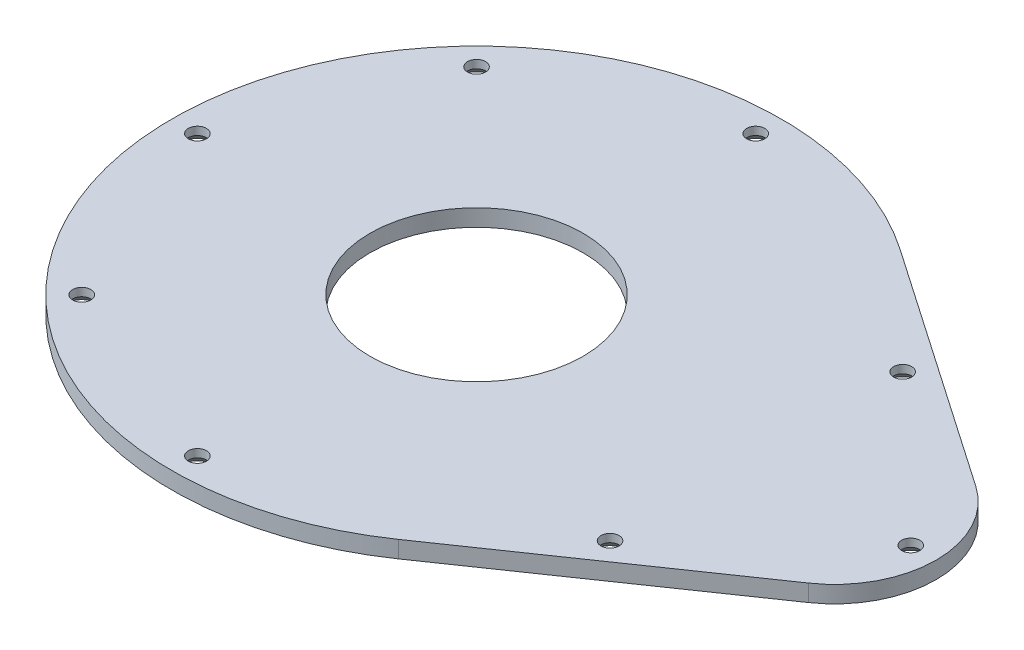
ISO-10303-21;
HEADER;
FILE_DESCRIPTION(('STEP AP214'),'2;1');
FILE_NAME('part.step','',(''),(''),'','','');
FILE_SCHEMA(('AUTOMOTIVE_DESIGN { 1 0 10303 214 1 1 1 1 }'));
ENDSEC;
DATA;
#1=APPLICATION_CONTEXT('core data for automotive mechanical design processes');
#2=APPLICATION_PROTOCOL_DEFINITION('international standard','automotive_design',2000,#1);
#3=PRODUCT_CONTEXT('',#1,'mechanical');
#4=PRODUCT('Part','Part','',(#3));
#5=PRODUCT_RELATED_PRODUCT_CATEGORY('part','',(#4));
#6=PRODUCT_DEFINITION_FORMATION('','',#4);
#7=PRODUCT_DEFINITION_CONTEXT('part definition',#1,'design');
#8=PRODUCT_DEFINITION('design','',#6,#7);
#9=PRODUCT_DEFINITION_SHAPE('','',#8);
#10=(LENGTH_UNIT() NAMED_UNIT(*) SI_UNIT(.MILLI.,.METRE.));
#11=(NAMED_UNIT(*) PLANE_ANGLE_UNIT() SI_UNIT($,.RADIAN.));
#12=(NAMED_UNIT(*) SI_UNIT($,.STERADIAN.) SOLID_ANGLE_UNIT());
#13=UNCERTAINTY_MEASURE_WITH_UNIT(LENGTH_MEASURE(1.E-05),#10,'distance_accuracy_value','');
#14=(GEOMETRIC_REPRESENTATION_CONTEXT(3) GLOBAL_UNCERTAINTY_ASSIGNED_CONTEXT((#13)) GLOBAL_UNIT_ASSIGNED_CONTEXT((#10,
#11,#12)) REPRESENTATION_CONTEXT('',''));
#15=CARTESIAN_POINT('',(0.,0.,0.));
#16=DIRECTION('',(0.,0.,1.));
#17=DIRECTION('',(1.,0.,0.));
#18=AXIS2_PLACEMENT_3D('',#15,#16,#17);
#19=CARTESIAN_POINT('',(0.,-3.175,0.));
#20=DIRECTION('',(0.,1.,0.));
#21=DIRECTION('',(0.,0.,1.));
#22=AXIS2_PLACEMENT_3D('',#19,#20,#21);
#23=CYLINDRICAL_SURFACE('',#22,57.15);
#24=DIRECTION('',(0.,-1.,0.));
#25=VECTOR('',#24,1.);
#26=CARTESIAN_POINT('',(32.4102079395085,108.442134940521,47.0712324176648));
#27=LINE('',#26,#25);
#28=CARTESIAN_POINT('',(32.4102079395085,0.,47.0712324176648));
#29=VERTEX_POINT('',#28);
#30=CARTESIAN_POINT('',(32.4102079395085,-3.175,47.0712324176648));
#31=VERTEX_POINT('',#30);
#32=EDGE_CURVE('E90',#29,#31,#27,.T.);
#33=ORIENTED_EDGE('',*,*,#32,.F.);
#34=CARTESIAN_POINT('',(0.,0.,0.));
#35=DIRECTION('',(0.,1.,0.));
#36=DIRECTION('',(0.,0.,1.));
#37=AXIS2_PLACEMENT_3D('',#34,#35,#36);
#38=CIRCLE('',#37,57.15);
#39=CARTESIAN_POINT('',(32.4102079395086,0.,-47.0712324176648));
#40=VERTEX_POINT('',#39);
#41=EDGE_CURVE('E35',#40,#29,#38,.T.);
#42=ORIENTED_EDGE('',*,*,#41,.F.);
#43=DIRECTION('',(0.,-1.,0.));
#44=VECTOR('',#43,1.);
#45=CARTESIAN_POINT('',(32.4102079395085,108.442134940521,-47.0712324176648));
#46=LINE('',#45,#44);
#47=CARTESIAN_POINT('',(32.4102079395085,-3.175,-47.0712324176648));
#48=VERTEX_POINT('',#47);
#49=EDGE_CURVE('E46',#40,#48,#46,.T.);
#50=ORIENTED_EDGE('',*,*,#49,.T.);
#51=CARTESIAN_POINT('',(0.,-3.175,0.));
#52=DIRECTION('',(0.,1.,0.));
#53=DIRECTION('',(0.,0.,1.));
#54=AXIS2_PLACEMENT_3D('',#51,#52,#53);
#55=CIRCLE('',#54,57.15);
#56=EDGE_CURVE('E11',#48,#31,#55,.T.);
#57=ORIENTED_EDGE('',*,*,#56,.T.);
#58=EDGE_LOOP('',(#33,#42,#50,#57));
#59=FACE_BOUND('',#58,.T.);
#60=ADVANCED_FACE('F32',(#59),#23,.T.);
#61=CARTESIAN_POINT('',(0.,-3.175,0.));
#62=DIRECTION('',(0.,1.,0.));
#63=DIRECTION('',(0.,0.,1.));
#64=AXIS2_PLACEMENT_3D('',#61,#62,#63);
#65=PLANE('',#64);
#66=CARTESIAN_POINT('',(0.,-3.175,52.3748));
#67=DIRECTION('',(0.,-1.,0.));
#68=DIRECTION('',(0.,0.,-1.));
#69=AXIS2_PLACEMENT_3D('',#66,#67,#68);
#70=CIRCLE('',#69,3.36);
#71=CARTESIAN_POINT('',(0.,-3.175,49.0148));
#72=VERTEX_POINT('',#71);
#73=EDGE_CURVE('E336',#72,#72,#70,.T.);
#74=ORIENTED_EDGE('',*,*,#73,.F.);
#75=EDGE_LOOP('',(#74));
#76=FACE_BOUND('',#75,.T.);
#77=CARTESIAN_POINT('',(-52.3748,-3.175,0.));
#78=DIRECTION('',(0.,-1.,0.));
#79=DIRECTION('',(0.,0.,-1.));
#80=AXIS2_PLACEMENT_3D('',#77,#78,#79);
#81=CIRCLE('',#80,3.36);
#82=CARTESIAN_POINT('',(-52.3748,-3.175,-3.35999999999999));
#83=VERTEX_POINT('',#82);
#84=EDGE_CURVE('E343',#83,#83,#81,.T.);
#85=ORIENTED_EDGE('',*,*,#84,.F.);
#86=EDGE_LOOP('',(#85));
#87=FACE_BOUND('',#86,.T.);
#88=CARTESIAN_POINT('',(-37.0345762432893,-3.175,-37.0345762432891));
#89=DIRECTION('',(0.,-1.,0.));
#90=DIRECTION('',(0.,0.,-1.));
#91=AXIS2_PLACEMENT_3D('',#88,#89,#90);
#92=CIRCLE('',#91,3.36);
#93=CARTESIAN_POINT('',(-37.0345762432893,-3.175,-40.3945762432891));
#94=VERTEX_POINT('',#93);
#95=EDGE_CURVE('E352',#94,#94,#92,.T.);
#96=ORIENTED_EDGE('',*,*,#95,.F.);
#97=EDGE_LOOP('',(#96));
#98=FACE_BOUND('',#97,.T.);
#99=CARTESIAN_POINT('',(0.,-3.175,-52.3748));
#100=DIRECTION('',(0.,-1.,0.));
#101=DIRECTION('',(0.,0.,-1.));
#102=AXIS2_PLACEMENT_3D('',#99,#100,#101);
#103=CIRCLE('',#102,3.36);
#104=CARTESIAN_POINT('',(0.,-3.175,-55.7348));
#105=VERTEX_POINT('',#104);
#106=EDGE_CURVE('E361',#105,#105,#103,.T.);
#107=ORIENTED_EDGE('',*,*,#106,.F.);
#108=EDGE_LOOP('',(#107));
#109=FACE_BOUND('',#108,.T.);
#110=CARTESIAN_POINT('',(52.490252362949,-3.175,-27.4477586364339));
#111=DIRECTION('',(0.,-1.,0.));
#112=DIRECTION('',(0.,0.,-1.));
#113=AXIS2_PLACEMENT_3D('',#110,#111,#112);
#114=CIRCLE('',#113,3.36);
#115=CARTESIAN_POINT('',(52.490252362949,-3.175,-30.8077586364339));
#116=VERTEX_POINT('',#115);
#117=EDGE_CURVE('E370',#116,#116,#114,.T.);
#118=ORIENTED_EDGE('',*,*,#117,.F.);
#119=EDGE_LOOP('',(#118));
#120=FACE_BOUND('',#119,.T.);
#121=CARTESIAN_POINT('',(81.4578,-3.175,0.));
#122=DIRECTION('',(0.,-1.,0.));
#123=DIRECTION('',(0.,0.,-1.));
#124=AXIS2_PLACEMENT_3D('',#121,#122,#123);
#125=CIRCLE('',#124,3.36);
#126=CARTESIAN_POINT('',(81.4578,-3.175,-3.36000000000001));
#127=VERTEX_POINT('',#126);
#128=EDGE_CURVE('E379',#127,#127,#125,.T.);
#129=ORIENTED_EDGE('',*,*,#128,.F.);
#130=EDGE_LOOP('',(#129));
#131=FACE_BOUND('',#130,.T.);
#132=CARTESIAN_POINT('',(52.490252362949,-3.175,27.4477586364339));
#133=DIRECTION('',(0.,-1.,0.));
#134=DIRECTION('',(0.,0.,-1.));
#135=AXIS2_PLACEMENT_3D('',#132,#133,#134);
#136=CIRCLE('',#135,3.36);
#137=CARTESIAN_POINT('',(52.490252362949,-3.175,24.0877586364339));
#138=VERTEX_POINT('',#137);
#139=EDGE_CURVE('E388',#138,#138,#136,.T.);
#140=ORIENTED_EDGE('',*,*,#139,.F.);
#141=EDGE_LOOP('',(#140));
#142=FACE_BOUND('',#141,.T.);
#143=CARTESIAN_POINT('',(-37.0345762432893,-3.175,37.0345762432891));
#144=DIRECTION('',(0.,-1.,0.));
#145=DIRECTION('',(0.,0.,-1.));
#146=AXIS2_PLACEMENT_3D('',#143,#144,#145);
#147=CIRCLE('',#146,3.36);
#148=CARTESIAN_POINT('',(-37.0345762432893,-3.175,33.6745762432891));
#149=VERTEX_POINT('',#148);
#150=EDGE_CURVE('E397',#149,#149,#147,.T.);
#151=ORIENTED_EDGE('',*,*,#150,.F.);
#152=EDGE_LOOP('',(#151));
#153=FACE_BOUND('',#152,.T.);
#154=CARTESIAN_POINT('',(0.,-3.175,0.));
#155=DIRECTION('',(0.,1.,0.));
#156=DIRECTION('',(0.,0.,1.));
#157=AXIS2_PLACEMENT_3D('',#154,#155,#156);
#158=CIRCLE('',#157,20.);
#159=CARTESIAN_POINT('',(0.,-3.175,20.));
#160=VERTEX_POINT('',#159);
#161=EDGE_CURVE('E108',#160,#160,#158,.T.);
#162=ORIENTED_EDGE('',*,*,#161,.T.);
#163=EDGE_LOOP('',(#162));
#164=FACE_BOUND('',#163,.T.);
#165=ORIENTED_EDGE('',*,*,#56,.F.);
#166=DIRECTION('',(0.823643611857652,0.,0.56710775047259));
#167=VECTOR('',#166,1.);
#168=CARTESIAN_POINT('',(32.4102079395085,-3.175,-47.0712324176648));
#169=LINE('',#168,#167);
#170=CARTESIAN_POINT('',(77.9864026465028,-3.175,-15.6904108058883));
#171=VERTEX_POINT('',#170);
#172=EDGE_CURVE('E78',#48,#171,#169,.T.);
#173=ORIENTED_EDGE('',*,*,#172,.T.);
#174=CARTESIAN_POINT('',(67.183,-3.175,0.));
#175=DIRECTION('',(0.,-1.,0.));
#176=DIRECTION('',(0.,0.,-1.));
#177=AXIS2_PLACEMENT_3D('',#174,#175,#176);
#178=CIRCLE('',#177,19.05);
#179=CARTESIAN_POINT('',(77.9864026465028,-3.175,15.6904108058883));
#180=VERTEX_POINT('',#179);
#181=EDGE_CURVE('E94',#171,#180,#178,.T.);
#182=ORIENTED_EDGE('',*,*,#181,.T.);
#183=DIRECTION('',(-0.823643611857652,0.,0.56710775047259));
#184=VECTOR('',#183,1.);
#185=CARTESIAN_POINT('',(32.4102079395085,-3.175,47.0712324176648));
#186=LINE('',#185,#184);
#187=EDGE_CURVE('E85',#180,#31,#186,.T.);
#188=ORIENTED_EDGE('',*,*,#187,.T.);
#189=EDGE_LOOP('',(#165,#173,#182,#188));
#190=FACE_BOUND('',#189,.T.);
#191=ADVANCED_FACE('F93',(#76,#87,#98,#109,#120,#131,#142,#153,#164,#190),#65,.F.);
#192=CARTESIAN_POINT('',(0.,0.,0.));
#193=DIRECTION('',(0.,1.,0.));
#194=DIRECTION('',(0.,0.,1.));
#195=AXIS2_PLACEMENT_3D('',#192,#193,#194);
#196=PLANE('',#195);
#197=CARTESIAN_POINT('',(0.,0.,52.3748));
#198=DIRECTION('',(0.,-1.,0.));
#199=DIRECTION('',(0.,0.,-1.));
#200=AXIS2_PLACEMENT_3D('',#197,#198,#199);
#201=CIRCLE('',#200,1.7);
#202=CARTESIAN_POINT('',(0.,0.,50.6748));
#203=VERTEX_POINT('',#202);
#204=EDGE_CURVE('E338',#203,#203,#201,.T.);
#205=ORIENTED_EDGE('',*,*,#204,.T.);
#206=EDGE_LOOP('',(#205));
#207=FACE_BOUND('',#206,.T.);
#208=CARTESIAN_POINT('',(-52.3748,0.,0.));
#209=DIRECTION('',(0.,-1.,0.));
#210=DIRECTION('',(0.,0.,-1.));
#211=AXIS2_PLACEMENT_3D('',#208,#209,#210);
#212=CIRCLE('',#211,1.7);
#213=CARTESIAN_POINT('',(-52.3748,0.,-1.69999999999998));
#214=VERTEX_POINT('',#213);
#215=EDGE_CURVE('E349',#214,#214,#212,.T.);
#216=ORIENTED_EDGE('',*,*,#215,.T.);
#217=EDGE_LOOP('',(#216));
#218=FACE_BOUND('',#217,.T.);
#219=CARTESIAN_POINT('',(-37.0345762432893,0.,-37.0345762432891));
#220=DIRECTION('',(0.,-1.,0.));
#221=DIRECTION('',(0.,0.,-1.));
#222=AXIS2_PLACEMENT_3D('',#219,#220,#221);
#223=CIRCLE('',#222,1.7);
#224=CARTESIAN_POINT('',(-37.0345762432893,0.,-38.7345762432891));
#225=VERTEX_POINT('',#224);
#226=EDGE_CURVE('E358',#225,#225,#223,.T.);
#227=ORIENTED_EDGE('',*,*,#226,.T.);
#228=EDGE_LOOP('',(#227));
#229=FACE_BOUND('',#228,.T.);
#230=CARTESIAN_POINT('',(0.,0.,-52.3748));
#231=DIRECTION('',(0.,-1.,0.));
#232=DIRECTION('',(0.,0.,-1.));
#233=AXIS2_PLACEMENT_3D('',#230,#231,#232);
#234=CIRCLE('',#233,1.7);
#235=CARTESIAN_POINT('',(0.,0.,-54.0748));
#236=VERTEX_POINT('',#235);
#237=EDGE_CURVE('E367',#236,#236,#234,.T.);
#238=ORIENTED_EDGE('',*,*,#237,.T.);
#239=EDGE_LOOP('',(#238));
#240=FACE_BOUND('',#239,.T.);
#241=CARTESIAN_POINT('',(52.490252362949,0.,-27.4477586364339));
#242=DIRECTION('',(0.,-1.,0.));
#243=DIRECTION('',(0.,0.,-1.));
#244=AXIS2_PLACEMENT_3D('',#241,#242,#243);
#245=CIRCLE('',#244,1.7);
#246=CARTESIAN_POINT('',(52.490252362949,0.,-29.1477586364339));
#247=VERTEX_POINT('',#246);
#248=EDGE_CURVE('E376',#247,#247,#245,.T.);
#249=ORIENTED_EDGE('',*,*,#248,.T.);
#250=EDGE_LOOP('',(#249));
#251=FACE_BOUND('',#250,.T.);
#252=CARTESIAN_POINT('',(81.4578,0.,0.));
#253=DIRECTION('',(0.,-1.,0.));
#254=DIRECTION('',(0.,0.,-1.));
#255=AXIS2_PLACEMENT_3D('',#252,#253,#254);
#256=CIRCLE('',#255,1.69999999999999);
#257=CARTESIAN_POINT('',(81.4578,0.,-1.7));
#258=VERTEX_POINT('',#257);
#259=EDGE_CURVE('E385',#258,#258,#256,.T.);
#260=ORIENTED_EDGE('',*,*,#259,.T.);
#261=EDGE_LOOP('',(#260));
#262=FACE_BOUND('',#261,.T.);
#263=CARTESIAN_POINT('',(52.490252362949,0.,27.4477586364339));
#264=DIRECTION('',(0.,-1.,0.));
#265=DIRECTION('',(0.,0.,-1.));
#266=AXIS2_PLACEMENT_3D('',#263,#264,#265);
#267=CIRCLE('',#266,1.7);
#268=CARTESIAN_POINT('',(52.490252362949,0.,25.7477586364339));
#269=VERTEX_POINT('',#268);
#270=EDGE_CURVE('E394',#269,#269,#267,.T.);
#271=ORIENTED_EDGE('',*,*,#270,.T.);
#272=EDGE_LOOP('',(#271));
#273=FACE_BOUND('',#272,.T.);
#274=CARTESIAN_POINT('',(-37.0345762432893,0.,37.0345762432891));
#275=DIRECTION('',(0.,-1.,0.));
#276=DIRECTION('',(0.,0.,-1.));
#277=AXIS2_PLACEMENT_3D('',#274,#275,#276);
#278=CIRCLE('',#277,1.7);
#279=CARTESIAN_POINT('',(-37.0345762432893,0.,35.3345762432891));
#280=VERTEX_POINT('',#279);
#281=EDGE_CURVE('E96',#280,#280,#278,.T.);
#282=ORIENTED_EDGE('',*,*,#281,.T.);
#283=EDGE_LOOP('',(#282));
#284=FACE_BOUND('',#283,.T.);
#285=CARTESIAN_POINT('',(0.,0.,0.));
#286=DIRECTION('',(0.,1.,0.));
#287=DIRECTION('',(0.,0.,1.));
#288=AXIS2_PLACEMENT_3D('',#285,#286,#287);
#289=CIRCLE('',#288,20.);
#290=CARTESIAN_POINT('',(0.,0.,20.));
#291=VERTEX_POINT('',#290);
#292=EDGE_CURVE('E107',#291,#291,#289,.T.);
#293=ORIENTED_EDGE('',*,*,#292,.F.);
#294=EDGE_LOOP('',(#293));
#295=FACE_BOUND('',#294,.T.);
#296=ORIENTED_EDGE('',*,*,#41,.T.);
#297=DIRECTION('',(-0.823643611857652,0.,0.56710775047259));
#298=VECTOR('',#297,1.);
#299=CARTESIAN_POINT('',(32.4102079395085,0.,47.0712324176648));
#300=LINE('',#299,#298);
#301=CARTESIAN_POINT('',(77.9864026465028,0.,15.6904108058883));
#302=VERTEX_POINT('',#301);
#303=EDGE_CURVE('E72',#302,#29,#300,.T.);
#304=ORIENTED_EDGE('',*,*,#303,.F.);
#305=CARTESIAN_POINT('',(67.183,0.,0.));
#306=DIRECTION('',(0.,1.,0.));
#307=DIRECTION('',(0.,0.,1.));
#308=AXIS2_PLACEMENT_3D('',#305,#306,#307);
#309=CIRCLE('',#308,19.05);
#310=CARTESIAN_POINT('',(77.9864026465028,0.,-15.6904108058883));
#311=VERTEX_POINT('',#310);
#312=EDGE_CURVE('E101',#311,#302,#309,.F.);
#313=ORIENTED_EDGE('',*,*,#312,.F.);
#314=DIRECTION('',(0.823643611857652,0.,0.56710775047259));
#315=VECTOR('',#314,1.);
#316=CARTESIAN_POINT('',(32.4102079395085,0.,-47.0712324176648));
#317=LINE('',#316,#315);
#318=EDGE_CURVE('E89',#40,#311,#317,.T.);
#319=ORIENTED_EDGE('',*,*,#318,.F.);
#320=EDGE_LOOP('',(#296,#304,#313,#319));
#321=FACE_BOUND('',#320,.T.);
#322=ADVANCED_FACE('F116',(#207,#218,#229,#240,#251,#262,#273,#284,#295,#321),#196,.T.);
#323=CARTESIAN_POINT('',(0.,-3.175,0.));
#324=DIRECTION('',(0.,1.,0.));
#325=DIRECTION('',(0.,0.,1.));
#326=AXIS2_PLACEMENT_3D('',#323,#324,#325);
#327=CYLINDRICAL_SURFACE('',#326,20.);
#328=ORIENTED_EDGE('',*,*,#161,.F.);
#329=EDGE_LOOP('',(#328));
#330=FACE_BOUND('',#329,.T.);
#331=ORIENTED_EDGE('',*,*,#292,.T.);
#332=EDGE_LOOP('',(#331));
#333=FACE_BOUND('',#332,.T.);
#334=ADVANCED_FACE('F114',(#330,#333),#327,.F.);
#335=CARTESIAN_POINT('',(32.4102079395085,108.442134940521,47.0712324176648));
#336=DIRECTION('',(0.56710775047259,0.,0.823643611857652));
#337=DIRECTION('',(0.823643611857652,0.,-0.56710775047259));
#338=AXIS2_PLACEMENT_3D('',#335,#336,#337);
#339=PLANE('',#338);
#340=DIRECTION('',(0.,-1.,0.));
#341=VECTOR('',#340,1.);
#342=CARTESIAN_POINT('',(77.9864026465028,108.442134940521,15.6904108058883));
#343=LINE('',#342,#341);
#344=EDGE_CURVE('E55',#302,#180,#343,.T.);
#345=ORIENTED_EDGE('',*,*,#344,.F.);
#346=ORIENTED_EDGE('',*,*,#303,.T.);
#347=ORIENTED_EDGE('',*,*,#32,.T.);
#348=ORIENTED_EDGE('',*,*,#187,.F.);
#349=EDGE_LOOP('',(#345,#346,#347,#348));
#350=FACE_BOUND('',#349,.T.);
#351=ADVANCED_FACE('F130',(#350),#339,.T.);
#352=CARTESIAN_POINT('',(32.4102079395085,108.442134940521,-47.0712324176648));
#353=DIRECTION('',(0.56710775047259,0.,-0.823643611857652));
#354=DIRECTION('',(-0.823643611857652,0.,-0.56710775047259));
#355=AXIS2_PLACEMENT_3D('',#352,#353,#354);
#356=PLANE('',#355);
#357=ORIENTED_EDGE('',*,*,#49,.F.);
#358=ORIENTED_EDGE('',*,*,#318,.T.);
#359=DIRECTION('',(0.,-1.,0.));
#360=VECTOR('',#359,1.);
#361=CARTESIAN_POINT('',(77.9864026465028,108.442134940521,-15.6904108058883));
#362=LINE('',#361,#360);
#363=EDGE_CURVE('E81',#311,#171,#362,.T.);
#364=ORIENTED_EDGE('',*,*,#363,.T.);
#365=ORIENTED_EDGE('',*,*,#172,.F.);
#366=EDGE_LOOP('',(#357,#358,#364,#365));
#367=FACE_BOUND('',#366,.T.);
#368=ADVANCED_FACE('F79',(#367),#356,.T.);
#369=CARTESIAN_POINT('',(67.183,108.442134940521,0.));
#370=DIRECTION('',(0.,-1.,0.));
#371=DIRECTION('',(0.,0.,-1.));
#372=AXIS2_PLACEMENT_3D('',#369,#370,#371);
#373=CYLINDRICAL_SURFACE('',#372,19.05);
#374=ORIENTED_EDGE('',*,*,#363,.F.);
#375=ORIENTED_EDGE('',*,*,#312,.T.);
#376=ORIENTED_EDGE('',*,*,#344,.T.);
#377=ORIENTED_EDGE('',*,*,#181,.F.);
#378=EDGE_LOOP('',(#374,#375,#376,#377));
#379=FACE_BOUND('',#378,.T.);
#380=ADVANCED_FACE('F119',(#379),#373,.T.);
#381=CARTESIAN_POINT('',(-37.0345762432893,-3.175,37.0345762432891));
#382=DIRECTION('',(0.,-1.,0.));
#383=DIRECTION('',(0.,0.,-1.));
#384=AXIS2_PLACEMENT_3D('',#381,#382,#383);
#385=CYLINDRICAL_SURFACE('',#384,1.7);
#386=ORIENTED_EDGE('',*,*,#281,.F.);
#387=EDGE_LOOP('',(#386));
#388=FACE_BOUND('',#387,.T.);
#389=CARTESIAN_POINT('',(-37.0345762432893,-1.515,37.0345762432891));
#390=DIRECTION('',(0.,-1.,0.));
#391=DIRECTION('',(0.,0.,-1.));
#392=AXIS2_PLACEMENT_3D('',#389,#390,#391);
#393=CIRCLE('',#392,1.7);
#394=CARTESIAN_POINT('',(-37.0345762432893,-1.515,35.3345762432891));
#395=VERTEX_POINT('',#394);
#396=EDGE_CURVE('E400',#395,#395,#393,.T.);
#397=ORIENTED_EDGE('',*,*,#396,.T.);
#398=EDGE_LOOP('',(#397));
#399=FACE_BOUND('',#398,.T.);
#400=ADVANCED_FACE('F121',(#388,#399),#385,.F.);
#401=CARTESIAN_POINT('',(-37.0345762432893,-3.175,37.0345762432891));
#402=DIRECTION('',(0.,-1.,0.));
#403=DIRECTION('',(0.,0.,-1.));
#404=AXIS2_PLACEMENT_3D('',#401,#402,#403);
#405=CONICAL_SURFACE('',#404,3.36,0.785398163397449);
#406=ORIENTED_EDGE('',*,*,#396,.F.);
#407=EDGE_LOOP('',(#406));
#408=FACE_BOUND('',#407,.T.);
#409=ORIENTED_EDGE('',*,*,#150,.T.);
#410=EDGE_LOOP('',(#409));
#411=FACE_BOUND('',#410,.T.);
#412=ADVANCED_FACE('F127',(#408,#411),#405,.F.);
#413=CARTESIAN_POINT('',(52.490252362949,-3.175,27.4477586364339));
#414=DIRECTION('',(0.,-1.,0.));
#415=DIRECTION('',(0.,0.,-1.));
#416=AXIS2_PLACEMENT_3D('',#413,#414,#415);
#417=CYLINDRICAL_SURFACE('',#416,1.7);
#418=ORIENTED_EDGE('',*,*,#270,.F.);
#419=EDGE_LOOP('',(#418));
#420=FACE_BOUND('',#419,.T.);
#421=CARTESIAN_POINT('',(52.490252362949,-1.515,27.4477586364339));
#422=DIRECTION('',(0.,-1.,0.));
#423=DIRECTION('',(0.,0.,-1.));
#424=AXIS2_PLACEMENT_3D('',#421,#422,#423);
#425=CIRCLE('',#424,1.7);
#426=CARTESIAN_POINT('',(52.490252362949,-1.515,25.7477586364339));
#427=VERTEX_POINT('',#426);
#428=EDGE_CURVE('E391',#427,#427,#425,.T.);
#429=ORIENTED_EDGE('',*,*,#428,.T.);
#430=EDGE_LOOP('',(#429));
#431=FACE_BOUND('',#430,.T.);
#432=ADVANCED_FACE('F187',(#420,#431),#417,.F.);
#433=CARTESIAN_POINT('',(52.490252362949,-3.175,27.4477586364339));
#434=DIRECTION('',(0.,-1.,0.));
#435=DIRECTION('',(0.,0.,-1.));
#436=AXIS2_PLACEMENT_3D('',#433,#434,#435);
#437=CONICAL_SURFACE('',#436,3.36,0.785398163397449);
#438=ORIENTED_EDGE('',*,*,#428,.F.);
#439=EDGE_LOOP('',(#438));
#440=FACE_BOUND('',#439,.T.);
#441=ORIENTED_EDGE('',*,*,#139,.T.);
#442=EDGE_LOOP('',(#441));
#443=FACE_BOUND('',#442,.T.);
#444=ADVANCED_FACE('F197',(#440,#443),#437,.F.);
#445=CARTESIAN_POINT('',(81.4578,-3.175,0.));
#446=DIRECTION('',(0.,-1.,0.));
#447=DIRECTION('',(0.,0.,-1.));
#448=AXIS2_PLACEMENT_3D('',#445,#446,#447);
#449=CYLINDRICAL_SURFACE('',#448,1.69999999999999);
#450=ORIENTED_EDGE('',*,*,#259,.F.);
#451=EDGE_LOOP('',(#450));
#452=FACE_BOUND('',#451,.T.);
#453=CARTESIAN_POINT('',(81.4578,-1.515,0.));
#454=DIRECTION('',(0.,-1.,0.));
#455=DIRECTION('',(0.,0.,-1.));
#456=AXIS2_PLACEMENT_3D('',#453,#454,#455);
#457=CIRCLE('',#456,1.69999999999999);
#458=CARTESIAN_POINT('',(81.4578,-1.515,-1.7));
#459=VERTEX_POINT('',#458);
#460=EDGE_CURVE('E382',#459,#459,#457,.T.);
#461=ORIENTED_EDGE('',*,*,#460,.T.);
#462=EDGE_LOOP('',(#461));
#463=FACE_BOUND('',#462,.T.);
#464=ADVANCED_FACE('F207',(#452,#463),#449,.F.);
#465=CARTESIAN_POINT('',(81.4578,-3.175,0.));
#466=DIRECTION('',(0.,-1.,0.));
#467=DIRECTION('',(0.,0.,-1.));
#468=AXIS2_PLACEMENT_3D('',#465,#466,#467);
#469=CONICAL_SURFACE('',#468,3.36,0.785398163397451);
#470=ORIENTED_EDGE('',*,*,#460,.F.);
#471=EDGE_LOOP('',(#470));
#472=FACE_BOUND('',#471,.T.);
#473=ORIENTED_EDGE('',*,*,#128,.T.);
#474=EDGE_LOOP('',(#473));
#475=FACE_BOUND('',#474,.T.);
#476=ADVANCED_FACE('F217',(#472,#475),#469,.F.);
#477=CARTESIAN_POINT('',(52.490252362949,-3.175,-27.4477586364339));
#478=DIRECTION('',(0.,-1.,0.));
#479=DIRECTION('',(0.,0.,-1.));
#480=AXIS2_PLACEMENT_3D('',#477,#478,#479);
#481=CYLINDRICAL_SURFACE('',#480,1.7);
#482=ORIENTED_EDGE('',*,*,#248,.F.);
#483=EDGE_LOOP('',(#482));
#484=FACE_BOUND('',#483,.T.);
#485=CARTESIAN_POINT('',(52.490252362949,-1.515,-27.4477586364339));
#486=DIRECTION('',(0.,-1.,0.));
#487=DIRECTION('',(0.,0.,-1.));
#488=AXIS2_PLACEMENT_3D('',#485,#486,#487);
#489=CIRCLE('',#488,1.7);
#490=CARTESIAN_POINT('',(52.490252362949,-1.515,-29.1477586364339));
#491=VERTEX_POINT('',#490);
#492=EDGE_CURVE('E373',#491,#491,#489,.T.);
#493=ORIENTED_EDGE('',*,*,#492,.T.);
#494=EDGE_LOOP('',(#493));
#495=FACE_BOUND('',#494,.T.);
#496=ADVANCED_FACE('F227',(#484,#495),#481,.F.);
#497=CARTESIAN_POINT('',(52.490252362949,-3.175,-27.4477586364339));
#498=DIRECTION('',(0.,-1.,0.));
#499=DIRECTION('',(0.,0.,-1.));
#500=AXIS2_PLACEMENT_3D('',#497,#498,#499);
#501=CONICAL_SURFACE('',#500,3.36,0.785398163397449);
#502=ORIENTED_EDGE('',*,*,#492,.F.);
#503=EDGE_LOOP('',(#502));
#504=FACE_BOUND('',#503,.T.);
#505=ORIENTED_EDGE('',*,*,#117,.T.);
#506=EDGE_LOOP('',(#505));
#507=FACE_BOUND('',#506,.T.);
#508=ADVANCED_FACE('F237',(#504,#507),#501,.F.);
#509=CARTESIAN_POINT('',(0.,-3.175,-52.3748));
#510=DIRECTION('',(0.,-1.,0.));
#511=DIRECTION('',(0.,0.,-1.));
#512=AXIS2_PLACEMENT_3D('',#509,#510,#511);
#513=CYLINDRICAL_SURFACE('',#512,1.7);
#514=ORIENTED_EDGE('',*,*,#237,.F.);
#515=EDGE_LOOP('',(#514));
#516=FACE_BOUND('',#515,.T.);
#517=CARTESIAN_POINT('',(0.,-1.515,-52.3748));
#518=DIRECTION('',(0.,-1.,0.));
#519=DIRECTION('',(0.,0.,-1.));
#520=AXIS2_PLACEMENT_3D('',#517,#518,#519);
#521=CIRCLE('',#520,1.7);
#522=CARTESIAN_POINT('',(0.,-1.515,-54.0748));
#523=VERTEX_POINT('',#522);
#524=EDGE_CURVE('E364',#523,#523,#521,.T.);
#525=ORIENTED_EDGE('',*,*,#524,.T.);
#526=EDGE_LOOP('',(#525));
#527=FACE_BOUND('',#526,.T.);
#528=ADVANCED_FACE('F247',(#516,#527),#513,.F.);
#529=CARTESIAN_POINT('',(0.,-3.175,-52.3748));
#530=DIRECTION('',(0.,-1.,0.));
#531=DIRECTION('',(0.,0.,-1.));
#532=AXIS2_PLACEMENT_3D('',#529,#530,#531);
#533=CONICAL_SURFACE('',#532,3.36,0.785398163397449);
#534=ORIENTED_EDGE('',*,*,#524,.F.);
#535=EDGE_LOOP('',(#534));
#536=FACE_BOUND('',#535,.T.);
#537=ORIENTED_EDGE('',*,*,#106,.T.);
#538=EDGE_LOOP('',(#537));
#539=FACE_BOUND('',#538,.T.);
#540=ADVANCED_FACE('F257',(#536,#539),#533,.F.);
#541=CARTESIAN_POINT('',(-37.0345762432893,-3.175,-37.0345762432891));
#542=DIRECTION('',(0.,-1.,0.));
#543=DIRECTION('',(0.,0.,-1.));
#544=AXIS2_PLACEMENT_3D('',#541,#542,#543);
#545=CYLINDRICAL_SURFACE('',#544,1.7);
#546=ORIENTED_EDGE('',*,*,#226,.F.);
#547=EDGE_LOOP('',(#546));
#548=FACE_BOUND('',#547,.T.);
#549=CARTESIAN_POINT('',(-37.0345762432893,-1.515,-37.0345762432891));
#550=DIRECTION('',(0.,-1.,0.));
#551=DIRECTION('',(0.,0.,-1.));
#552=AXIS2_PLACEMENT_3D('',#549,#550,#551);
#553=CIRCLE('',#552,1.7);
#554=CARTESIAN_POINT('',(-37.0345762432893,-1.515,-38.7345762432891));
#555=VERTEX_POINT('',#554);
#556=EDGE_CURVE('E355',#555,#555,#553,.T.);
#557=ORIENTED_EDGE('',*,*,#556,.T.);
#558=EDGE_LOOP('',(#557));
#559=FACE_BOUND('',#558,.T.);
#560=ADVANCED_FACE('F267',(#548,#559),#545,.F.);
#561=CARTESIAN_POINT('',(-37.0345762432893,-3.175,-37.0345762432891));
#562=DIRECTION('',(0.,-1.,0.));
#563=DIRECTION('',(0.,0.,-1.));
#564=AXIS2_PLACEMENT_3D('',#561,#562,#563);
#565=CONICAL_SURFACE('',#564,3.36,0.785398163397449);
#566=ORIENTED_EDGE('',*,*,#556,.F.);
#567=EDGE_LOOP('',(#566));
#568=FACE_BOUND('',#567,.T.);
#569=ORIENTED_EDGE('',*,*,#95,.T.);
#570=EDGE_LOOP('',(#569));
#571=FACE_BOUND('',#570,.T.);
#572=ADVANCED_FACE('F277',(#568,#571),#565,.F.);
#573=CARTESIAN_POINT('',(-52.3748,-3.175,0.));
#574=DIRECTION('',(0.,-1.,0.));
#575=DIRECTION('',(0.,0.,-1.));
#576=AXIS2_PLACEMENT_3D('',#573,#574,#575);
#577=CYLINDRICAL_SURFACE('',#576,1.7);
#578=ORIENTED_EDGE('',*,*,#215,.F.);
#579=EDGE_LOOP('',(#578));
#580=FACE_BOUND('',#579,.T.);
#581=CARTESIAN_POINT('',(-52.3748,-1.515,0.));
#582=DIRECTION('',(0.,-1.,0.));
#583=DIRECTION('',(0.,0.,-1.));
#584=AXIS2_PLACEMENT_3D('',#581,#582,#583);
#585=CIRCLE('',#584,1.7);
#586=CARTESIAN_POINT('',(-52.3748,-1.515,-1.69999999999998));
#587=VERTEX_POINT('',#586);
#588=EDGE_CURVE('E346',#587,#587,#585,.T.);
#589=ORIENTED_EDGE('',*,*,#588,.T.);
#590=EDGE_LOOP('',(#589));
#591=FACE_BOUND('',#590,.T.);
#592=ADVANCED_FACE('F287',(#580,#591),#577,.F.);
#593=CARTESIAN_POINT('',(-52.3748,-3.175,0.));
#594=DIRECTION('',(0.,-1.,0.));
#595=DIRECTION('',(0.,0.,-1.));
#596=AXIS2_PLACEMENT_3D('',#593,#594,#595);
#597=CONICAL_SURFACE('',#596,3.36,0.785398163397449);
#598=ORIENTED_EDGE('',*,*,#588,.F.);
#599=EDGE_LOOP('',(#598));
#600=FACE_BOUND('',#599,.T.);
#601=ORIENTED_EDGE('',*,*,#84,.T.);
#602=EDGE_LOOP('',(#601));
#603=FACE_BOUND('',#602,.T.);
#604=ADVANCED_FACE('F297',(#600,#603),#597,.F.);
#605=CARTESIAN_POINT('',(0.,-3.175,52.3748));
#606=DIRECTION('',(0.,-1.,0.));
#607=DIRECTION('',(0.,0.,-1.));
#608=AXIS2_PLACEMENT_3D('',#605,#606,#607);
#609=CYLINDRICAL_SURFACE('',#608,1.7);
#610=ORIENTED_EDGE('',*,*,#204,.F.);
#611=EDGE_LOOP('',(#610));
#612=FACE_BOUND('',#611,.T.);
#613=CARTESIAN_POINT('',(0.,-1.515,52.3748));
#614=DIRECTION('',(0.,-1.,0.));
#615=DIRECTION('',(0.,0.,-1.));
#616=AXIS2_PLACEMENT_3D('',#613,#614,#615);
#617=CIRCLE('',#616,1.7);
#618=CARTESIAN_POINT('',(0.,-1.515,50.6748));
#619=VERTEX_POINT('',#618);
#620=EDGE_CURVE('E334',#619,#619,#617,.T.);
#621=ORIENTED_EDGE('',*,*,#620,.T.);
#622=EDGE_LOOP('',(#621));
#623=FACE_BOUND('',#622,.T.);
#624=ADVANCED_FACE('F307',(#612,#623),#609,.F.);
#625=CARTESIAN_POINT('',(0.,-3.175,52.3748));
#626=DIRECTION('',(0.,-1.,0.));
#627=DIRECTION('',(0.,0.,-1.));
#628=AXIS2_PLACEMENT_3D('',#625,#626,#627);
#629=CONICAL_SURFACE('',#628,3.36,0.785398163397449);
#630=ORIENTED_EDGE('',*,*,#620,.F.);
#631=EDGE_LOOP('',(#630));
#632=FACE_BOUND('',#631,.T.);
#633=ORIENTED_EDGE('',*,*,#73,.T.);
#634=EDGE_LOOP('',(#633));
#635=FACE_BOUND('',#634,.T.);
#636=ADVANCED_FACE('F317',(#632,#635),#629,.F.);
#637=CLOSED_SHELL('',(#60,#191,#322,#334,#351,#368,#380,#400,#412,#432,#444,#464,#476,#496,#508,
#528,#540,#560,#572,#592,#604,#624,#636));
#638=MANIFOLD_SOLID_BREP('B2',#637);
#639=ADVANCED_BREP_SHAPE_REPRESENTATION('',(#18,#638),#14);
#640=SHAPE_DEFINITION_REPRESENTATION(#9,#639);
ENDSEC;
END-ISO-10303-21;
